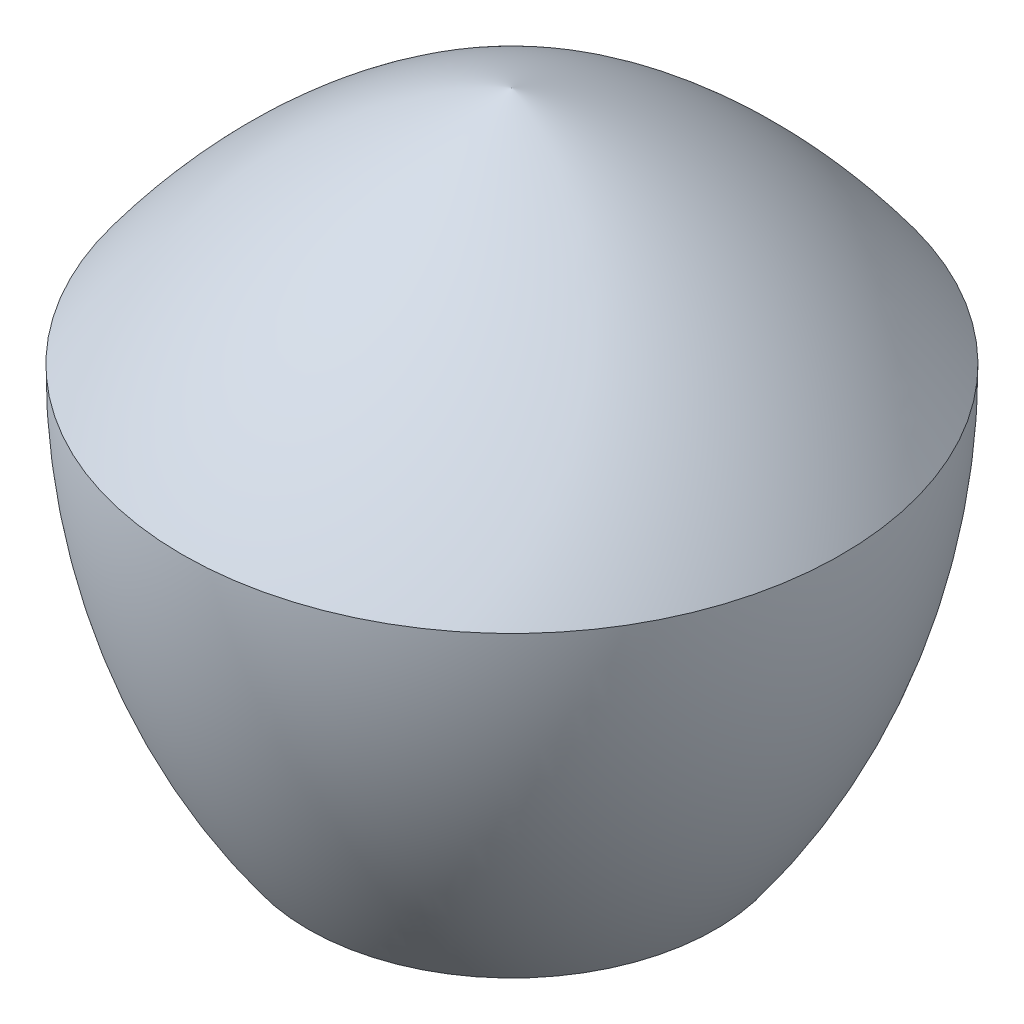
ISO-10303-21;
HEADER;
FILE_DESCRIPTION(('STEP AP214'),'2;1');
FILE_NAME('part.step','',(''),(''),'','','');
FILE_SCHEMA(('AUTOMOTIVE_DESIGN { 1 0 10303 214 1 1 1 1 }'));
ENDSEC;
DATA;
#1=APPLICATION_CONTEXT('core data for automotive mechanical design processes');
#2=APPLICATION_PROTOCOL_DEFINITION('international standard','automotive_design',2000,#1);
#3=PRODUCT_CONTEXT('',#1,'mechanical');
#4=PRODUCT('Part','Part','',(#3));
#5=PRODUCT_RELATED_PRODUCT_CATEGORY('part','',(#4));
#6=PRODUCT_DEFINITION_FORMATION('','',#4);
#7=PRODUCT_DEFINITION_CONTEXT('part definition',#1,'design');
#8=PRODUCT_DEFINITION('design','',#6,#7);
#9=PRODUCT_DEFINITION_SHAPE('','',#8);
#10=(LENGTH_UNIT() NAMED_UNIT(*) SI_UNIT(.MILLI.,.METRE.));
#11=(NAMED_UNIT(*) PLANE_ANGLE_UNIT() SI_UNIT($,.RADIAN.));
#12=(NAMED_UNIT(*) SI_UNIT($,.STERADIAN.) SOLID_ANGLE_UNIT());
#13=UNCERTAINTY_MEASURE_WITH_UNIT(LENGTH_MEASURE(1.E-05),#10,'distance_accuracy_value','');
#14=(GEOMETRIC_REPRESENTATION_CONTEXT(3) GLOBAL_UNCERTAINTY_ASSIGNED_CONTEXT((#13)) GLOBAL_UNIT_ASSIGNED_CONTEXT((#10,
#11,#12)) REPRESENTATION_CONTEXT('',''));
#15=CARTESIAN_POINT('',(0.,0.,0.));
#16=DIRECTION('',(0.,0.,1.));
#17=DIRECTION('',(1.,0.,0.));
#18=AXIS2_PLACEMENT_3D('',#15,#16,#17);
#19=CARTESIAN_POINT('',(0.,-10.7094505065086,-7.72542485937369));
#20=DIRECTION('',(-1.,0.,0.));
#21=DIRECTION('',(0.,0.,1.));
#22=AXIS2_PLACEMENT_3D('',#19,#20,#21);
#23=CIRCLE('',#22,25.);
#24=TRIMMED_CURVE('',#23,(PARAMETER_VALUE(-1.25663706143592)),
(PARAMETER_VALUE(1.25663706143592)),.T.,.PARAMETER.);
#25=CARTESIAN_POINT('',(0.,-10.7094505065086,0.));
#26=DIRECTION('',(0.,1.,0.));
#27=AXIS1_PLACEMENT('',#25,#26);
#28=SURFACE_OF_REVOLUTION('',#24,#27);
#29=CARTESIAN_POINT('',(0.,13.0669624008702,0.));
#30=VERTEX_POINT('',#29);
#31=VERTEX_LOOP('',#30);
#32=FACE_BOUND('',#31,.T.);
#33=CARTESIAN_POINT('',(0.,3.98518080080323,0.));
#34=DIRECTION('',(0.,1.,0.));
#35=DIRECTION('',(0.,0.,1.));
#36=AXIS2_PLACEMENT_3D('',#33,#34,#35);
#37=CIRCLE('',#36,12.5);
#38=CARTESIAN_POINT('',(0.,3.98518080080323,12.5));
#39=VERTEX_POINT('',#38);
#40=EDGE_CURVE('E11',#39,#39,#37,.T.);
#41=ORIENTED_EDGE('',*,*,#40,.T.);
#42=EDGE_LOOP('',(#41));
#43=FACE_BOUND('',#42,.T.);
#44=ADVANCED_FACE('F35',(#32,#43),#28,.T.);
#45=CARTESIAN_POINT('',(0.,3.98518080080324,0.));
#46=DIRECTION('',(0.,1.,0.));
#47=DIRECTION('',(0.,0.,1.));
#48=AXIS2_PLACEMENT_3D('',#45,#46,#47);
#49=DEGENERATE_TOROIDAL_SURFACE('',#48,12.5,25.,.F.);
#50=ORIENTED_EDGE('',*,*,#40,.F.);
#51=EDGE_LOOP('',(#50));
#52=FACE_BOUND('',#51,.T.);
#53=CARTESIAN_POINT('',(0.,-10.7094505065086,0.));
#54=DIRECTION('',(0.,1.,0.));
#55=DIRECTION('',(0.,0.,1.));
#56=AXIS2_PLACEMENT_3D('',#53,#54,#55);
#57=CIRCLE('',#56,7.72542485937369);
#58=CARTESIAN_POINT('',(0.,-10.7094505065086,7.72542485937369));
#59=VERTEX_POINT('',#58);
#60=EDGE_CURVE('E41',#59,#59,#57,.T.);
#61=ORIENTED_EDGE('',*,*,#60,.T.);
#62=EDGE_LOOP('',(#61));
#63=FACE_BOUND('',#62,.T.);
#64=ADVANCED_FACE('F46',(#52,#63),#49,.F.);
#65=CARTESIAN_POINT('',(0.,13.0669624008702,0.));
#66=DIRECTION('',(0.,1.,0.));
#67=DIRECTION('',(-1.,0.,0.));
#68=AXIS2_PLACEMENT_3D('',#65,#66,#67);
#69=SPHERICAL_SURFACE('',#68,25.);
#70=ORIENTED_EDGE('',*,*,#60,.F.);
#71=EDGE_LOOP('',(#70));
#72=FACE_BOUND('',#71,.T.);
#73=ADVANCED_FACE('F51',(#72),#69,.T.);
#74=CLOSED_SHELL('',(#44,#64,#73));
#75=MANIFOLD_SOLID_BREP('B2',#74);
#76=ADVANCED_BREP_SHAPE_REPRESENTATION('',(#18,#75),#14);
#77=SHAPE_DEFINITION_REPRESENTATION(#9,#76);
ENDSEC;
END-ISO-10303-21;
